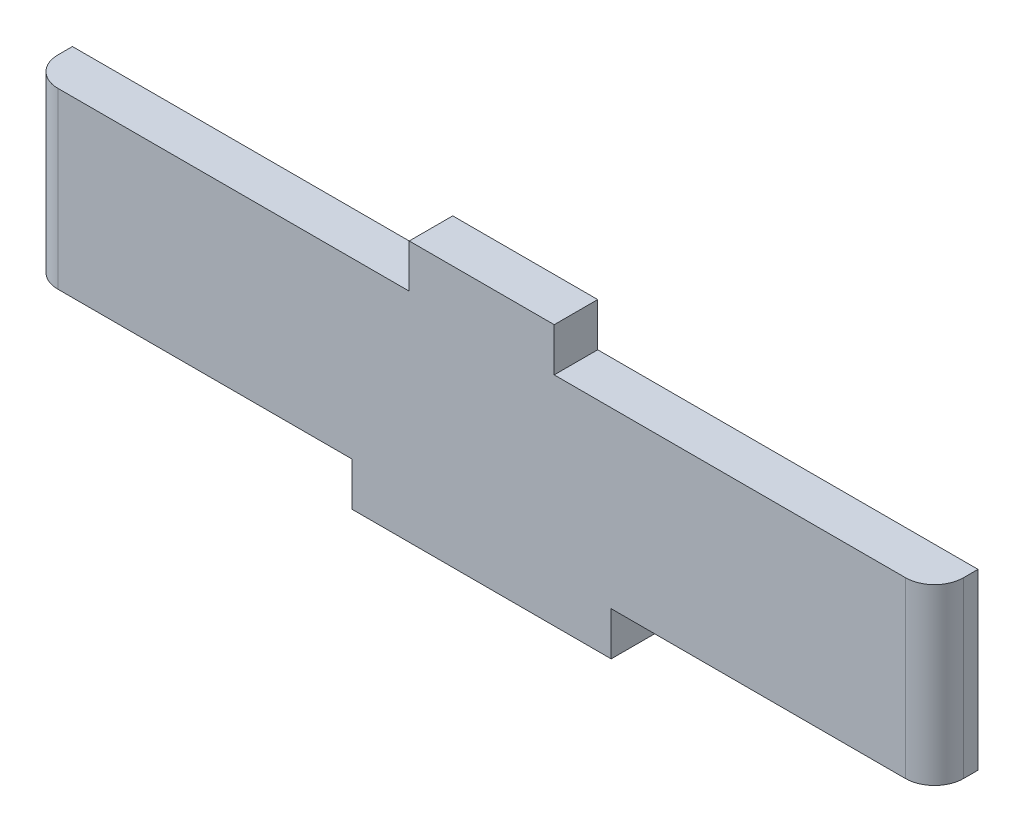
ISO-10303-21;
HEADER;
FILE_DESCRIPTION(('STEP AP214'),'2;1');
FILE_NAME('part.step','',(''),(''),'','','');
FILE_SCHEMA(('AUTOMOTIVE_DESIGN { 1 0 10303 214 1 1 1 1 }'));
ENDSEC;
DATA;
#1=APPLICATION_CONTEXT('core data for automotive mechanical design processes');
#2=APPLICATION_PROTOCOL_DEFINITION('international standard','automotive_design',2000,#1);
#3=PRODUCT_CONTEXT('',#1,'mechanical');
#4=PRODUCT('Part','Part','',(#3));
#5=PRODUCT_RELATED_PRODUCT_CATEGORY('part','',(#4));
#6=PRODUCT_DEFINITION_FORMATION('','',#4);
#7=PRODUCT_DEFINITION_CONTEXT('part definition',#1,'design');
#8=PRODUCT_DEFINITION('design','',#6,#7);
#9=PRODUCT_DEFINITION_SHAPE('','',#8);
#10=(LENGTH_UNIT() NAMED_UNIT(*) SI_UNIT(.MILLI.,.METRE.));
#11=(NAMED_UNIT(*) PLANE_ANGLE_UNIT() SI_UNIT($,.RADIAN.));
#12=(NAMED_UNIT(*) SI_UNIT($,.STERADIAN.) SOLID_ANGLE_UNIT());
#13=UNCERTAINTY_MEASURE_WITH_UNIT(LENGTH_MEASURE(1.E-05),#10,'distance_accuracy_value','');
#14=(GEOMETRIC_REPRESENTATION_CONTEXT(3) GLOBAL_UNCERTAINTY_ASSIGNED_CONTEXT((#13)) GLOBAL_UNIT_ASSIGNED_CONTEXT((#10,
#11,#12)) REPRESENTATION_CONTEXT('',''));
#15=CARTESIAN_POINT('',(0.,0.,0.));
#16=DIRECTION('',(0.,0.,1.));
#17=DIRECTION('',(1.,0.,0.));
#18=AXIS2_PLACEMENT_3D('',#15,#16,#17);
#19=CARTESIAN_POINT('',(31.23,9.,3.));
#20=DIRECTION('',(-1.,0.,0.));
#21=DIRECTION('',(0.,-1.,0.));
#22=AXIS2_PLACEMENT_3D('',#19,#20,#21);
#23=PLANE('',#22);
#24=DIRECTION('',(0.,0.,1.));
#25=VECTOR('',#24,1.);
#26=CARTESIAN_POINT('',(31.23,6.,0.));
#27=LINE('',#26,#25);
#28=CARTESIAN_POINT('',(31.23,6.,0.));
#29=VERTEX_POINT('',#28);
#30=CARTESIAN_POINT('',(31.23,6.,1.));
#31=VERTEX_POINT('',#30);
#32=EDGE_CURVE('E194',#29,#31,#27,.T.);
#33=ORIENTED_EDGE('',*,*,#32,.T.);
#34=DIRECTION('',(0.,1.,0.));
#35=VECTOR('',#34,1.);
#36=CARTESIAN_POINT('',(31.23,-6.,1.));
#37=LINE('',#36,#35);
#38=CARTESIAN_POINT('',(31.23,-6.,1.));
#39=VERTEX_POINT('',#38);
#40=EDGE_CURVE('E169',#31,#39,#37,.F.);
#41=ORIENTED_EDGE('',*,*,#40,.T.);
#42=DIRECTION('',(0.,0.,1.));
#43=VECTOR('',#42,1.);
#44=CARTESIAN_POINT('',(31.23,-6.,0.));
#45=LINE('',#44,#43);
#46=CARTESIAN_POINT('',(31.23,-6.,0.));
#47=VERTEX_POINT('',#46);
#48=EDGE_CURVE('E230',#47,#39,#45,.T.);
#49=ORIENTED_EDGE('',*,*,#48,.F.);
#50=DIRECTION('',(0.,1.,0.));
#51=VECTOR('',#50,1.);
#52=CARTESIAN_POINT('',(31.23,9.,0.));
#53=LINE('',#52,#51);
#54=EDGE_CURVE('E159',#47,#29,#53,.T.);
#55=ORIENTED_EDGE('',*,*,#54,.T.);
#56=EDGE_LOOP('',(#33,#41,#49,#55));
#57=FACE_BOUND('',#56,.T.);
#58=ADVANCED_FACE('F32',(#57),#23,.F.);
#59=CARTESIAN_POINT('',(-31.23,9.,3.));
#60=DIRECTION('',(0.,-1.,0.));
#61=DIRECTION('',(0.,0.,-1.));
#62=AXIS2_PLACEMENT_3D('',#59,#60,#61);
#63=PLANE('',#62);
#64=DIRECTION('',(-1.,0.,0.));
#65=VECTOR('',#64,1.);
#66=CARTESIAN_POINT('',(-31.23,9.,3.));
#67=LINE('',#66,#65);
#68=CARTESIAN_POINT('',(4.99999999999997,9.,3.));
#69=VERTEX_POINT('',#68);
#70=CARTESIAN_POINT('',(-5.00000000000003,8.99999999999999,3.));
#71=VERTEX_POINT('',#70);
#72=EDGE_CURVE('E156',#69,#71,#67,.T.);
#73=ORIENTED_EDGE('',*,*,#72,.F.);
#74=DIRECTION('',(0.,0.,1.));
#75=VECTOR('',#74,1.);
#76=CARTESIAN_POINT('',(4.99999999999997,9.,0.));
#77=LINE('',#76,#75);
#78=CARTESIAN_POINT('',(4.99999999999997,9.,0.));
#79=VERTEX_POINT('',#78);
#80=EDGE_CURVE('E211',#79,#69,#77,.T.);
#81=ORIENTED_EDGE('',*,*,#80,.F.);
#82=DIRECTION('',(-1.,0.,0.));
#83=VECTOR('',#82,1.);
#84=CARTESIAN_POINT('',(-31.23,9.,0.));
#85=LINE('',#84,#83);
#86=CARTESIAN_POINT('',(-5.00000000000003,8.99999999999999,0.));
#87=VERTEX_POINT('',#86);
#88=EDGE_CURVE('E153',#79,#87,#85,.T.);
#89=ORIENTED_EDGE('',*,*,#88,.T.);
#90=DIRECTION('',(0.,0.,1.));
#91=VECTOR('',#90,1.);
#92=CARTESIAN_POINT('',(-5.00000000000003,8.99999999999999,0.));
#93=LINE('',#92,#91);
#94=EDGE_CURVE('E215',#87,#71,#93,.T.);
#95=ORIENTED_EDGE('',*,*,#94,.T.);
#96=EDGE_LOOP('',(#73,#81,#89,#95));
#97=FACE_BOUND('',#96,.T.);
#98=ADVANCED_FACE('F286',(#97),#63,.F.);
#99=CARTESIAN_POINT('',(-31.23,9.,3.));
#100=DIRECTION('',(1.,0.,0.));
#101=DIRECTION('',(0.,1.,0.));
#102=AXIS2_PLACEMENT_3D('',#99,#100,#101);
#103=PLANE('',#102);
#104=DIRECTION('',(0.,0.,1.));
#105=VECTOR('',#104,1.);
#106=CARTESIAN_POINT('',(-31.23,-6.,0.));
#107=LINE('',#106,#105);
#108=CARTESIAN_POINT('',(-31.23,-6.,0.));
#109=VERTEX_POINT('',#108);
#110=CARTESIAN_POINT('',(-31.23,-6.,1.));
#111=VERTEX_POINT('',#110);
#112=EDGE_CURVE('E198',#109,#111,#107,.T.);
#113=ORIENTED_EDGE('',*,*,#112,.T.);
#114=DIRECTION('',(0.,-1.,0.));
#115=VECTOR('',#114,1.);
#116=CARTESIAN_POINT('',(-31.23,6.,1.));
#117=LINE('',#116,#115);
#118=CARTESIAN_POINT('',(-31.23,6.,1.));
#119=VERTEX_POINT('',#118);
#120=EDGE_CURVE('E40',#111,#119,#117,.F.);
#121=ORIENTED_EDGE('',*,*,#120,.T.);
#122=DIRECTION('',(0.,0.,1.));
#123=VECTOR('',#122,1.);
#124=CARTESIAN_POINT('',(-31.23,6.,0.));
#125=LINE('',#124,#123);
#126=CARTESIAN_POINT('',(-31.23,6.,0.));
#127=VERTEX_POINT('',#126);
#128=EDGE_CURVE('E134',#127,#119,#125,.T.);
#129=ORIENTED_EDGE('',*,*,#128,.F.);
#130=DIRECTION('',(0.,-1.,0.));
#131=VECTOR('',#130,1.);
#132=CARTESIAN_POINT('',(-31.23,9.,0.));
#133=LINE('',#132,#131);
#134=EDGE_CURVE('E146',#127,#109,#133,.T.);
#135=ORIENTED_EDGE('',*,*,#134,.T.);
#136=EDGE_LOOP('',(#113,#121,#129,#135));
#137=FACE_BOUND('',#136,.T.);
#138=ADVANCED_FACE('F145',(#137),#103,.F.);
#139=CARTESIAN_POINT('',(-31.23,-9.,3.));
#140=DIRECTION('',(0.,1.,0.));
#141=DIRECTION('',(0.,0.,1.));
#142=AXIS2_PLACEMENT_3D('',#139,#140,#141);
#143=PLANE('',#142);
#144=DIRECTION('',(1.,0.,0.));
#145=VECTOR('',#144,1.);
#146=CARTESIAN_POINT('',(-31.23,-9.,3.));
#147=LINE('',#146,#145);
#148=CARTESIAN_POINT('',(-8.94000000000002,-9.00000000000001,3.));
#149=VERTEX_POINT('',#148);
#150=CARTESIAN_POINT('',(8.92999999999998,-9.,3.));
#151=VERTEX_POINT('',#150);
#152=EDGE_CURVE('E167',#149,#151,#147,.T.);
#153=ORIENTED_EDGE('',*,*,#152,.F.);
#154=DIRECTION('',(0.,0.,1.));
#155=VECTOR('',#154,1.);
#156=CARTESIAN_POINT('',(-8.94000000000002,-9.00000000000001,0.));
#157=LINE('',#156,#155);
#158=CARTESIAN_POINT('',(-8.94000000000002,-9.00000000000001,0.));
#159=VERTEX_POINT('',#158);
#160=EDGE_CURVE('E202',#159,#149,#157,.T.);
#161=ORIENTED_EDGE('',*,*,#160,.F.);
#162=DIRECTION('',(1.,0.,0.));
#163=VECTOR('',#162,1.);
#164=CARTESIAN_POINT('',(-31.23,-9.,0.));
#165=LINE('',#164,#163);
#166=CARTESIAN_POINT('',(8.92999999999998,-9.,0.));
#167=VERTEX_POINT('',#166);
#168=EDGE_CURVE('E152',#159,#167,#165,.T.);
#169=ORIENTED_EDGE('',*,*,#168,.T.);
#170=DIRECTION('',(0.,0.,1.));
#171=VECTOR('',#170,1.);
#172=CARTESIAN_POINT('',(8.92999999999998,-9.,0.));
#173=LINE('',#172,#171);
#174=EDGE_CURVE('E233',#167,#151,#173,.T.);
#175=ORIENTED_EDGE('',*,*,#174,.T.);
#176=EDGE_LOOP('',(#153,#161,#169,#175));
#177=FACE_BOUND('',#176,.T.);
#178=ADVANCED_FACE('F273',(#177),#143,.F.);
#179=CARTESIAN_POINT('',(0.,0.,3.));
#180=DIRECTION('',(0.,0.,1.));
#181=DIRECTION('',(1.,0.,0.));
#182=AXIS2_PLACEMENT_3D('',#179,#180,#181);
#183=PLANE('',#182);
#184=DIRECTION('',(1.,0.,0.));
#185=VECTOR('',#184,1.);
#186=CARTESIAN_POINT('',(-31.23,6.,3.));
#187=LINE('',#186,#185);
#188=CARTESIAN_POINT('',(-29.23,6.,3.));
#189=VERTEX_POINT('',#188);
#190=CARTESIAN_POINT('',(-5.00000000000003,5.99999999999999,3.));
#191=VERTEX_POINT('',#190);
#192=EDGE_CURVE('E184',#189,#191,#187,.T.);
#193=ORIENTED_EDGE('',*,*,#192,.F.);
#194=DIRECTION('',(0.,-1.,0.));
#195=VECTOR('',#194,1.);
#196=CARTESIAN_POINT('',(-29.23,-6.,3.));
#197=LINE('',#196,#195);
#198=CARTESIAN_POINT('',(-29.23,-6.,3.));
#199=VERTEX_POINT('',#198);
#200=EDGE_CURVE('E173',#189,#199,#197,.T.);
#201=ORIENTED_EDGE('',*,*,#200,.T.);
#202=DIRECTION('',(-1.,0.,0.));
#203=VECTOR('',#202,1.);
#204=CARTESIAN_POINT('',(-31.23,-6.,3.));
#205=LINE('',#204,#203);
#206=CARTESIAN_POINT('',(-8.94000000000002,-6.,3.));
#207=VERTEX_POINT('',#206);
#208=EDGE_CURVE('E182',#207,#199,#205,.T.);
#209=ORIENTED_EDGE('',*,*,#208,.F.);
#210=DIRECTION('',(0.,1.,0.));
#211=VECTOR('',#210,1.);
#212=CARTESIAN_POINT('',(-8.94000000000002,-9.00000000000001,3.));
#213=LINE('',#212,#211);
#214=EDGE_CURVE('E191',#149,#207,#213,.T.);
#215=ORIENTED_EDGE('',*,*,#214,.F.);
#216=ORIENTED_EDGE('',*,*,#152,.T.);
#217=DIRECTION('',(0.,-1.,0.));
#218=VECTOR('',#217,1.);
#219=CARTESIAN_POINT('',(8.92999999999998,-9.,3.));
#220=LINE('',#219,#218);
#221=CARTESIAN_POINT('',(8.92999999999998,-6.,3.));
#222=VERTEX_POINT('',#221);
#223=EDGE_CURVE('E227',#222,#151,#220,.T.);
#224=ORIENTED_EDGE('',*,*,#223,.F.);
#225=DIRECTION('',(-1.,0.,0.));
#226=VECTOR('',#225,1.);
#227=CARTESIAN_POINT('',(31.23,-6.,3.));
#228=LINE('',#227,#226);
#229=CARTESIAN_POINT('',(29.23,-6.,3.));
#230=VERTEX_POINT('',#229);
#231=EDGE_CURVE('E200',#230,#222,#228,.T.);
#232=ORIENTED_EDGE('',*,*,#231,.F.);
#233=DIRECTION('',(0.,1.,0.));
#234=VECTOR('',#233,1.);
#235=CARTESIAN_POINT('',(29.23,6.,3.));
#236=LINE('',#235,#234);
#237=CARTESIAN_POINT('',(29.23,6.,3.));
#238=VERTEX_POINT('',#237);
#239=EDGE_CURVE('E163',#230,#238,#236,.T.);
#240=ORIENTED_EDGE('',*,*,#239,.T.);
#241=DIRECTION('',(1.,0.,0.));
#242=VECTOR('',#241,1.);
#243=CARTESIAN_POINT('',(31.23,6.,3.));
#244=LINE('',#243,#242);
#245=CARTESIAN_POINT('',(4.99999999999997,6.,3.));
#246=VERTEX_POINT('',#245);
#247=EDGE_CURVE('E208',#246,#238,#244,.T.);
#248=ORIENTED_EDGE('',*,*,#247,.F.);
#249=DIRECTION('',(0.,-1.,0.));
#250=VECTOR('',#249,1.);
#251=CARTESIAN_POINT('',(4.99999999999997,9.,3.));
#252=LINE('',#251,#250);
#253=EDGE_CURVE('E212',#69,#246,#252,.T.);
#254=ORIENTED_EDGE('',*,*,#253,.F.);
#255=ORIENTED_EDGE('',*,*,#72,.T.);
#256=DIRECTION('',(0.,1.,0.));
#257=VECTOR('',#256,1.);
#258=CARTESIAN_POINT('',(-5.00000000000003,8.99999999999999,3.));
#259=LINE('',#258,#257);
#260=EDGE_CURVE('E142',#191,#71,#259,.T.);
#261=ORIENTED_EDGE('',*,*,#260,.F.);
#262=EDGE_LOOP('',(#193,#201,#209,#215,#216,#224,#232,#240,#248,#254,#255,#261));
#263=FACE_BOUND('',#262,.T.);
#264=ADVANCED_FACE('F180',(#263),#183,.T.);
#265=CARTESIAN_POINT('',(0.,0.,0.));
#266=DIRECTION('',(0.,0.,1.));
#267=DIRECTION('',(1.,0.,0.));
#268=AXIS2_PLACEMENT_3D('',#265,#266,#267);
#269=PLANE('',#268);
#270=DIRECTION('',(0.,1.,0.));
#271=VECTOR('',#270,1.);
#272=CARTESIAN_POINT('',(-8.94000000000002,-9.00000000000001,0.));
#273=LINE('',#272,#271);
#274=CARTESIAN_POINT('',(-8.94000000000002,-6.,0.));
#275=VERTEX_POINT('',#274);
#276=EDGE_CURVE('E190',#159,#275,#273,.T.);
#277=ORIENTED_EDGE('',*,*,#276,.T.);
#278=DIRECTION('',(-1.,0.,0.));
#279=VECTOR('',#278,1.);
#280=CARTESIAN_POINT('',(-31.23,-6.,0.));
#281=LINE('',#280,#279);
#282=EDGE_CURVE('E151',#275,#109,#281,.T.);
#283=ORIENTED_EDGE('',*,*,#282,.T.);
#284=ORIENTED_EDGE('',*,*,#134,.F.);
#285=DIRECTION('',(1.,0.,0.));
#286=VECTOR('',#285,1.);
#287=CARTESIAN_POINT('',(-31.23,6.,0.));
#288=LINE('',#287,#286);
#289=CARTESIAN_POINT('',(-5.00000000000003,5.99999999999999,0.));
#290=VERTEX_POINT('',#289);
#291=EDGE_CURVE('E132',#127,#290,#288,.T.);
#292=ORIENTED_EDGE('',*,*,#291,.T.);
#293=DIRECTION('',(0.,1.,0.));
#294=VECTOR('',#293,1.);
#295=CARTESIAN_POINT('',(-5.00000000000003,8.99999999999999,0.));
#296=LINE('',#295,#294);
#297=EDGE_CURVE('E141',#290,#87,#296,.T.);
#298=ORIENTED_EDGE('',*,*,#297,.T.);
#299=ORIENTED_EDGE('',*,*,#88,.F.);
#300=DIRECTION('',(0.,-1.,0.));
#301=VECTOR('',#300,1.);
#302=CARTESIAN_POINT('',(4.99999999999997,9.,0.));
#303=LINE('',#302,#301);
#304=CARTESIAN_POINT('',(4.99999999999997,6.,0.));
#305=VERTEX_POINT('',#304);
#306=EDGE_CURVE('E204',#79,#305,#303,.T.);
#307=ORIENTED_EDGE('',*,*,#306,.T.);
#308=DIRECTION('',(1.,0.,0.));
#309=VECTOR('',#308,1.);
#310=CARTESIAN_POINT('',(31.23,6.,0.));
#311=LINE('',#310,#309);
#312=EDGE_CURVE('E207',#305,#29,#311,.T.);
#313=ORIENTED_EDGE('',*,*,#312,.T.);
#314=ORIENTED_EDGE('',*,*,#54,.F.);
#315=DIRECTION('',(-1.,0.,0.));
#316=VECTOR('',#315,1.);
#317=CARTESIAN_POINT('',(31.23,-6.,0.));
#318=LINE('',#317,#316);
#319=CARTESIAN_POINT('',(8.92999999999998,-6.,0.));
#320=VERTEX_POINT('',#319);
#321=EDGE_CURVE('E223',#47,#320,#318,.T.);
#322=ORIENTED_EDGE('',*,*,#321,.T.);
#323=DIRECTION('',(0.,-1.,0.));
#324=VECTOR('',#323,1.);
#325=CARTESIAN_POINT('',(8.92999999999998,-9.,0.));
#326=LINE('',#325,#324);
#327=EDGE_CURVE('E226',#320,#167,#326,.T.);
#328=ORIENTED_EDGE('',*,*,#327,.T.);
#329=ORIENTED_EDGE('',*,*,#168,.F.);
#330=EDGE_LOOP('',(#277,#283,#284,#292,#298,#299,#307,#313,#314,#322,#328,#329));
#331=FACE_BOUND('',#330,.T.);
#332=ADVANCED_FACE('F150',(#331),#269,.F.);
#333=CARTESIAN_POINT('',(8.92999999999998,-9.,0.));
#334=DIRECTION('',(-1.,0.,0.));
#335=DIRECTION('',(0.,0.,1.));
#336=AXIS2_PLACEMENT_3D('',#333,#334,#335);
#337=PLANE('',#336);
#338=ORIENTED_EDGE('',*,*,#223,.T.);
#339=ORIENTED_EDGE('',*,*,#174,.F.);
#340=ORIENTED_EDGE('',*,*,#327,.F.);
#341=DIRECTION('',(0.,0.,1.));
#342=VECTOR('',#341,1.);
#343=CARTESIAN_POINT('',(8.92999999999998,-6.,0.));
#344=LINE('',#343,#342);
#345=EDGE_CURVE('E236',#320,#222,#344,.T.);
#346=ORIENTED_EDGE('',*,*,#345,.T.);
#347=EDGE_LOOP('',(#338,#339,#340,#346));
#348=FACE_BOUND('',#347,.T.);
#349=ADVANCED_FACE('F269',(#348),#337,.F.);
#350=CARTESIAN_POINT('',(31.23,-6.,0.));
#351=DIRECTION('',(0.,1.,0.));
#352=DIRECTION('',(-1.,0.,0.));
#353=AXIS2_PLACEMENT_3D('',#350,#351,#352);
#354=PLANE('',#353);
#355=ORIENTED_EDGE('',*,*,#48,.T.);
#356=CARTESIAN_POINT('',(29.23,-6.,1.));
#357=DIRECTION('',(0.,1.,0.));
#358=DIRECTION('',(-1.,0.,0.));
#359=AXIS2_PLACEMENT_3D('',#356,#357,#358);
#360=CIRCLE('',#359,2.);
#361=EDGE_CURVE('E171',#39,#230,#360,.F.);
#362=ORIENTED_EDGE('',*,*,#361,.T.);
#363=ORIENTED_EDGE('',*,*,#231,.T.);
#364=ORIENTED_EDGE('',*,*,#345,.F.);
#365=ORIENTED_EDGE('',*,*,#321,.F.);
#366=EDGE_LOOP('',(#355,#362,#363,#364,#365));
#367=FACE_BOUND('',#366,.T.);
#368=ADVANCED_FACE('F265',(#367),#354,.F.);
#369=CARTESIAN_POINT('',(-5.00000000000003,8.99999999999999,0.));
#370=DIRECTION('',(1.,0.,0.));
#371=DIRECTION('',(0.,0.,-1.));
#372=AXIS2_PLACEMENT_3D('',#369,#370,#371);
#373=PLANE('',#372);
#374=ORIENTED_EDGE('',*,*,#260,.T.);
#375=ORIENTED_EDGE('',*,*,#94,.F.);
#376=ORIENTED_EDGE('',*,*,#297,.F.);
#377=DIRECTION('',(0.,0.,1.));
#378=VECTOR('',#377,1.);
#379=CARTESIAN_POINT('',(-5.00000000000003,5.99999999999999,0.));
#380=LINE('',#379,#378);
#381=EDGE_CURVE('E137',#290,#191,#380,.T.);
#382=ORIENTED_EDGE('',*,*,#381,.T.);
#383=EDGE_LOOP('',(#374,#375,#376,#382));
#384=FACE_BOUND('',#383,.T.);
#385=ADVANCED_FACE('F304',(#384),#373,.F.);
#386=CARTESIAN_POINT('',(-31.23,6.,0.));
#387=DIRECTION('',(0.,-1.,0.));
#388=DIRECTION('',(1.,0.,0.));
#389=AXIS2_PLACEMENT_3D('',#386,#387,#388);
#390=PLANE('',#389);
#391=ORIENTED_EDGE('',*,*,#128,.T.);
#392=CARTESIAN_POINT('',(-29.23,6.,1.));
#393=DIRECTION('',(0.,-1.,0.));
#394=DIRECTION('',(1.,0.,0.));
#395=AXIS2_PLACEMENT_3D('',#392,#393,#394);
#396=CIRCLE('',#395,2.);
#397=EDGE_CURVE('E11',#119,#189,#396,.F.);
#398=ORIENTED_EDGE('',*,*,#397,.T.);
#399=ORIENTED_EDGE('',*,*,#192,.T.);
#400=ORIENTED_EDGE('',*,*,#381,.F.);
#401=ORIENTED_EDGE('',*,*,#291,.F.);
#402=EDGE_LOOP('',(#391,#398,#399,#400,#401));
#403=FACE_BOUND('',#402,.T.);
#404=ADVANCED_FACE('F133',(#403),#390,.F.);
#405=CARTESIAN_POINT('',(31.23,6.,0.));
#406=DIRECTION('',(0.,-1.,0.));
#407=DIRECTION('',(1.,0.,0.));
#408=AXIS2_PLACEMENT_3D('',#405,#406,#407);
#409=PLANE('',#408);
#410=ORIENTED_EDGE('',*,*,#247,.T.);
#411=CARTESIAN_POINT('',(29.23,6.,1.));
#412=DIRECTION('',(0.,-1.,0.));
#413=DIRECTION('',(1.,0.,0.));
#414=AXIS2_PLACEMENT_3D('',#411,#412,#413);
#415=CIRCLE('',#414,2.);
#416=EDGE_CURVE('E166',#238,#31,#415,.F.);
#417=ORIENTED_EDGE('',*,*,#416,.T.);
#418=ORIENTED_EDGE('',*,*,#32,.F.);
#419=ORIENTED_EDGE('',*,*,#312,.F.);
#420=DIRECTION('',(0.,0.,1.));
#421=VECTOR('',#420,1.);
#422=CARTESIAN_POINT('',(4.99999999999997,6.,0.));
#423=LINE('',#422,#421);
#424=EDGE_CURVE('E220',#305,#246,#423,.T.);
#425=ORIENTED_EDGE('',*,*,#424,.T.);
#426=EDGE_LOOP('',(#410,#417,#418,#419,#425));
#427=FACE_BOUND('',#426,.T.);
#428=ADVANCED_FACE('F252',(#427),#409,.F.);
#429=CARTESIAN_POINT('',(4.99999999999997,9.,0.));
#430=DIRECTION('',(-1.,0.,0.));
#431=DIRECTION('',(0.,0.,1.));
#432=AXIS2_PLACEMENT_3D('',#429,#430,#431);
#433=PLANE('',#432);
#434=ORIENTED_EDGE('',*,*,#253,.T.);
#435=ORIENTED_EDGE('',*,*,#424,.F.);
#436=ORIENTED_EDGE('',*,*,#306,.F.);
#437=ORIENTED_EDGE('',*,*,#80,.T.);
#438=EDGE_LOOP('',(#434,#435,#436,#437));
#439=FACE_BOUND('',#438,.T.);
#440=ADVANCED_FACE('F254',(#439),#433,.F.);
#441=CARTESIAN_POINT('',(-31.23,-6.,0.));
#442=DIRECTION('',(0.,1.,0.));
#443=DIRECTION('',(-1.,0.,0.));
#444=AXIS2_PLACEMENT_3D('',#441,#442,#443);
#445=PLANE('',#444);
#446=ORIENTED_EDGE('',*,*,#208,.T.);
#447=CARTESIAN_POINT('',(-29.23,-6.,1.));
#448=DIRECTION('',(0.,1.,0.));
#449=DIRECTION('',(-1.,0.,0.));
#450=AXIS2_PLACEMENT_3D('',#447,#448,#449);
#451=CIRCLE('',#450,2.);
#452=EDGE_CURVE('E54',#199,#111,#451,.F.);
#453=ORIENTED_EDGE('',*,*,#452,.T.);
#454=ORIENTED_EDGE('',*,*,#112,.F.);
#455=ORIENTED_EDGE('',*,*,#282,.F.);
#456=DIRECTION('',(0.,0.,1.));
#457=VECTOR('',#456,1.);
#458=CARTESIAN_POINT('',(-8.94000000000002,-6.,0.));
#459=LINE('',#458,#457);
#460=EDGE_CURVE('E188',#275,#207,#459,.T.);
#461=ORIENTED_EDGE('',*,*,#460,.T.);
#462=EDGE_LOOP('',(#446,#453,#454,#455,#461));
#463=FACE_BOUND('',#462,.T.);
#464=ADVANCED_FACE('F186',(#463),#445,.F.);
#465=CARTESIAN_POINT('',(-8.94000000000002,-9.00000000000001,0.));
#466=DIRECTION('',(1.,0.,0.));
#467=DIRECTION('',(0.,0.,-1.));
#468=AXIS2_PLACEMENT_3D('',#465,#466,#467);
#469=PLANE('',#468);
#470=ORIENTED_EDGE('',*,*,#214,.T.);
#471=ORIENTED_EDGE('',*,*,#460,.F.);
#472=ORIENTED_EDGE('',*,*,#276,.F.);
#473=ORIENTED_EDGE('',*,*,#160,.T.);
#474=EDGE_LOOP('',(#470,#471,#472,#473));
#475=FACE_BOUND('',#474,.T.);
#476=ADVANCED_FACE('F276',(#475),#469,.F.);
#477=CARTESIAN_POINT('',(29.23,0.,1.));
#478=DIRECTION('',(0.,-1.,0.));
#479=DIRECTION('',(1.,0.,0.));
#480=AXIS2_PLACEMENT_3D('',#477,#478,#479);
#481=CYLINDRICAL_SURFACE('',#480,2.);
#482=ORIENTED_EDGE('',*,*,#361,.F.);
#483=ORIENTED_EDGE('',*,*,#40,.F.);
#484=ORIENTED_EDGE('',*,*,#416,.F.);
#485=ORIENTED_EDGE('',*,*,#239,.F.);
#486=EDGE_LOOP('',(#482,#483,#484,#485));
#487=FACE_BOUND('',#486,.T.);
#488=ADVANCED_FACE('F263',(#487),#481,.T.);
#489=CARTESIAN_POINT('',(-29.23,0.,1.));
#490=DIRECTION('',(0.,1.,0.));
#491=DIRECTION('',(-1.,0.,0.));
#492=AXIS2_PLACEMENT_3D('',#489,#490,#491);
#493=CYLINDRICAL_SURFACE('',#492,2.);
#494=ORIENTED_EDGE('',*,*,#397,.F.);
#495=ORIENTED_EDGE('',*,*,#120,.F.);
#496=ORIENTED_EDGE('',*,*,#452,.F.);
#497=ORIENTED_EDGE('',*,*,#200,.F.);
#498=EDGE_LOOP('',(#494,#495,#496,#497));
#499=FACE_BOUND('',#498,.T.);
#500=ADVANCED_FACE('F34',(#499),#493,.T.);
#501=CLOSED_SHELL('',(#58,#98,#138,#178,#264,#332,#349,#368,#385,#404,#428,#440,#464,#476,#488,#500));
#502=MANIFOLD_SOLID_BREP('B2',#501);
#503=ADVANCED_BREP_SHAPE_REPRESENTATION('',(#18,#502),#14);
#504=SHAPE_DEFINITION_REPRESENTATION(#9,#503);
ENDSEC;
END-ISO-10303-21;
